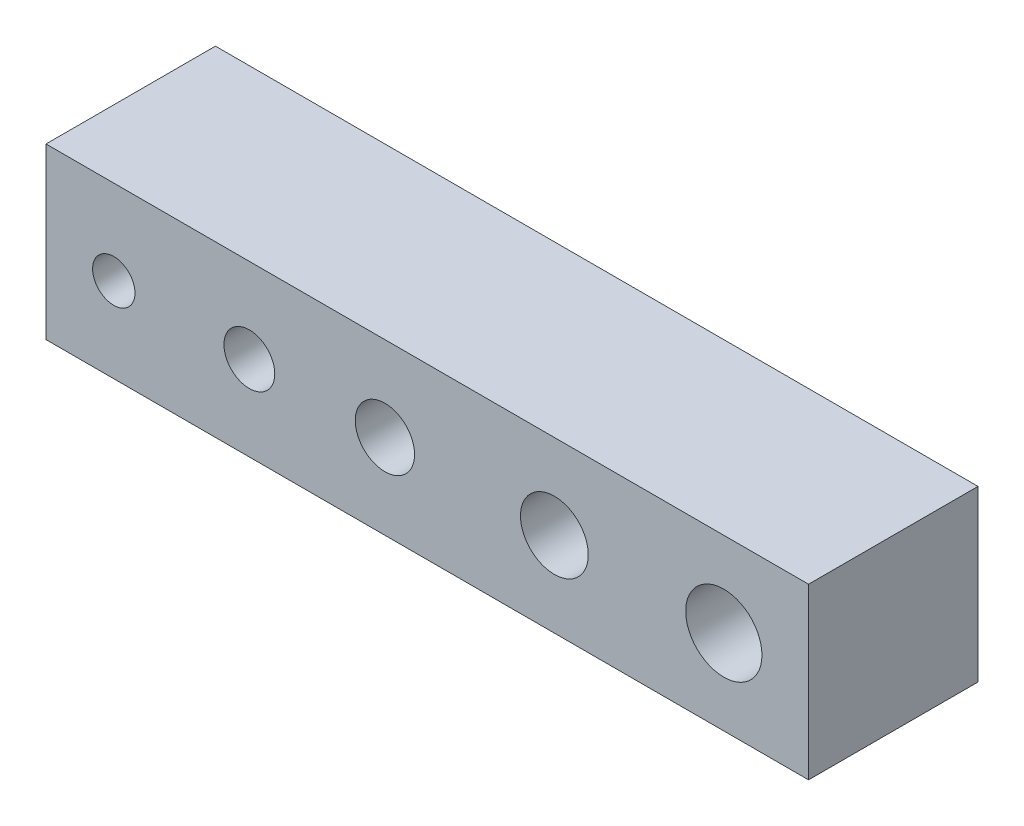
ISO-10303-21;
HEADER;
FILE_DESCRIPTION(('STEP AP214'),'2;1');
FILE_NAME('part.step','',(''),(''),'','','');
FILE_SCHEMA(('AUTOMOTIVE_DESIGN { 1 0 10303 214 1 1 1 1 }'));
ENDSEC;
DATA;
#1=APPLICATION_CONTEXT('core data for automotive mechanical design processes');
#2=APPLICATION_PROTOCOL_DEFINITION('international standard','automotive_design',2000,#1);
#3=PRODUCT_CONTEXT('',#1,'mechanical');
#4=PRODUCT('Part','Part','',(#3));
#5=PRODUCT_RELATED_PRODUCT_CATEGORY('part','',(#4));
#6=PRODUCT_DEFINITION_FORMATION('','',#4);
#7=PRODUCT_DEFINITION_CONTEXT('part definition',#1,'design');
#8=PRODUCT_DEFINITION('design','',#6,#7);
#9=PRODUCT_DEFINITION_SHAPE('','',#8);
#10=(LENGTH_UNIT() NAMED_UNIT(*) SI_UNIT(.MILLI.,.METRE.));
#11=(NAMED_UNIT(*) PLANE_ANGLE_UNIT() SI_UNIT($,.RADIAN.));
#12=(NAMED_UNIT(*) SI_UNIT($,.STERADIAN.) SOLID_ANGLE_UNIT());
#13=UNCERTAINTY_MEASURE_WITH_UNIT(LENGTH_MEASURE(1.E-05),#10,'distance_accuracy_value','');
#14=(GEOMETRIC_REPRESENTATION_CONTEXT(3) GLOBAL_UNCERTAINTY_ASSIGNED_CONTEXT((#13)) GLOBAL_UNIT_ASSIGNED_CONTEXT((#10,
#11,#12)) REPRESENTATION_CONTEXT('',''));
#15=CARTESIAN_POINT('',(0.,0.,0.));
#16=DIRECTION('',(0.,0.,1.));
#17=DIRECTION('',(1.,0.,0.));
#18=AXIS2_PLACEMENT_3D('',#15,#16,#17);
#19=CARTESIAN_POINT('',(0.,0.,10.));
#20=DIRECTION('',(-1.,0.,0.));
#21=DIRECTION('',(0.,-1.,0.));
#22=AXIS2_PLACEMENT_3D('',#19,#20,#21);
#23=PLANE('',#22);
#24=DIRECTION('',(0.,1.,0.));
#25=VECTOR('',#24,1.);
#26=CARTESIAN_POINT('',(0.,0.,0.));
#27=LINE('',#26,#25);
#28=CARTESIAN_POINT('',(0.,-10.,0.));
#29=VERTEX_POINT('',#28);
#30=CARTESIAN_POINT('',(0.,0.,0.));
#31=VERTEX_POINT('',#30);
#32=EDGE_CURVE('E110',#29,#31,#27,.T.);
#33=ORIENTED_EDGE('',*,*,#32,.T.);
#34=DIRECTION('',(0.,0.,-1.));
#35=VECTOR('',#34,1.);
#36=CARTESIAN_POINT('',(0.,0.,10.));
#37=LINE('',#36,#35);
#38=CARTESIAN_POINT('',(0.,0.,10.));
#39=VERTEX_POINT('',#38);
#40=EDGE_CURVE('E11',#39,#31,#37,.T.);
#41=ORIENTED_EDGE('',*,*,#40,.F.);
#42=DIRECTION('',(0.,1.,0.));
#43=VECTOR('',#42,1.);
#44=CARTESIAN_POINT('',(0.,0.,10.));
#45=LINE('',#44,#43);
#46=CARTESIAN_POINT('',(0.,-10.,10.));
#47=VERTEX_POINT('',#46);
#48=EDGE_CURVE('E93',#47,#39,#45,.T.);
#49=ORIENTED_EDGE('',*,*,#48,.F.);
#50=DIRECTION('',(0.,0.,-1.));
#51=VECTOR('',#50,1.);
#52=CARTESIAN_POINT('',(0.,-10.,10.));
#53=LINE('',#52,#51);
#54=EDGE_CURVE('E106',#47,#29,#53,.T.);
#55=ORIENTED_EDGE('',*,*,#54,.T.);
#56=EDGE_LOOP('',(#33,#41,#49,#55));
#57=FACE_BOUND('',#56,.T.);
#58=ADVANCED_FACE('F39',(#57),#23,.F.);
#59=CARTESIAN_POINT('',(0.,0.,10.));
#60=DIRECTION('',(0.,-1.,0.));
#61=DIRECTION('',(1.,0.,0.));
#62=AXIS2_PLACEMENT_3D('',#59,#60,#61);
#63=PLANE('',#62);
#64=DIRECTION('',(-1.,0.,0.));
#65=VECTOR('',#64,1.);
#66=CARTESIAN_POINT('',(0.,0.,0.));
#67=LINE('',#66,#65);
#68=CARTESIAN_POINT('',(-45.,0.,0.));
#69=VERTEX_POINT('',#68);
#70=EDGE_CURVE('E98',#31,#69,#67,.T.);
#71=ORIENTED_EDGE('',*,*,#70,.T.);
#72=DIRECTION('',(0.,0.,-1.));
#73=VECTOR('',#72,1.);
#74=CARTESIAN_POINT('',(-45.,0.,10.));
#75=LINE('',#74,#73);
#76=CARTESIAN_POINT('',(-45.,0.,10.));
#77=VERTEX_POINT('',#76);
#78=EDGE_CURVE('E49',#77,#69,#75,.T.);
#79=ORIENTED_EDGE('',*,*,#78,.F.);
#80=DIRECTION('',(-1.,0.,0.));
#81=VECTOR('',#80,1.);
#82=CARTESIAN_POINT('',(0.,0.,10.));
#83=LINE('',#82,#81);
#84=EDGE_CURVE('E88',#39,#77,#83,.T.);
#85=ORIENTED_EDGE('',*,*,#84,.F.);
#86=ORIENTED_EDGE('',*,*,#40,.T.);
#87=EDGE_LOOP('',(#71,#79,#85,#86));
#88=FACE_BOUND('',#87,.T.);
#89=ADVANCED_FACE('F97',(#88),#63,.F.);
#90=CARTESIAN_POINT('',(-45.,0.,10.));
#91=DIRECTION('',(1.,0.,0.));
#92=DIRECTION('',(0.,0.,-1.));
#93=AXIS2_PLACEMENT_3D('',#90,#91,#92);
#94=PLANE('',#93);
#95=DIRECTION('',(0.,-1.,0.));
#96=VECTOR('',#95,1.);
#97=CARTESIAN_POINT('',(-45.,0.,0.));
#98=LINE('',#97,#96);
#99=CARTESIAN_POINT('',(-45.,-10.,0.));
#100=VERTEX_POINT('',#99);
#101=EDGE_CURVE('E75',#69,#100,#98,.T.);
#102=ORIENTED_EDGE('',*,*,#101,.T.);
#103=DIRECTION('',(0.,0.,-1.));
#104=VECTOR('',#103,1.);
#105=CARTESIAN_POINT('',(-45.,-10.,10.));
#106=LINE('',#105,#104);
#107=CARTESIAN_POINT('',(-45.,-10.,10.));
#108=VERTEX_POINT('',#107);
#109=EDGE_CURVE('E100',#108,#100,#106,.T.);
#110=ORIENTED_EDGE('',*,*,#109,.F.);
#111=DIRECTION('',(0.,-1.,0.));
#112=VECTOR('',#111,1.);
#113=CARTESIAN_POINT('',(-45.,0.,10.));
#114=LINE('',#113,#112);
#115=EDGE_CURVE('E91',#77,#108,#114,.T.);
#116=ORIENTED_EDGE('',*,*,#115,.F.);
#117=ORIENTED_EDGE('',*,*,#78,.T.);
#118=EDGE_LOOP('',(#102,#110,#116,#117));
#119=FACE_BOUND('',#118,.T.);
#120=ADVANCED_FACE('F102',(#119),#94,.F.);
#121=CARTESIAN_POINT('',(0.,-10.,10.));
#122=DIRECTION('',(0.,1.,0.));
#123=DIRECTION('',(-1.,0.,0.));
#124=AXIS2_PLACEMENT_3D('',#121,#122,#123);
#125=PLANE('',#124);
#126=DIRECTION('',(1.,0.,0.));
#127=VECTOR('',#126,1.);
#128=CARTESIAN_POINT('',(0.,-10.,0.));
#129=LINE('',#128,#127);
#130=EDGE_CURVE('E81',#100,#29,#129,.T.);
#131=ORIENTED_EDGE('',*,*,#130,.T.);
#132=ORIENTED_EDGE('',*,*,#54,.F.);
#133=DIRECTION('',(1.,0.,0.));
#134=VECTOR('',#133,1.);
#135=CARTESIAN_POINT('',(0.,-10.,10.));
#136=LINE('',#135,#134);
#137=EDGE_CURVE('E58',#108,#47,#136,.T.);
#138=ORIENTED_EDGE('',*,*,#137,.F.);
#139=ORIENTED_EDGE('',*,*,#109,.T.);
#140=EDGE_LOOP('',(#131,#132,#138,#139));
#141=FACE_BOUND('',#140,.T.);
#142=ADVANCED_FACE('F162',(#141),#125,.F.);
#143=CARTESIAN_POINT('',(0.,0.,10.));
#144=DIRECTION('',(0.,0.,-1.));
#145=DIRECTION('',(-1.,0.,0.));
#146=AXIS2_PLACEMENT_3D('',#143,#144,#145);
#147=PLANE('',#146);
#148=CARTESIAN_POINT('',(-41.,-5.00000000000001,10.));
#149=DIRECTION('',(0.,0.,1.));
#150=DIRECTION('',(1.,0.,0.));
#151=AXIS2_PLACEMENT_3D('',#148,#149,#150);
#152=CIRCLE('',#151,1.25);
#153=CARTESIAN_POINT('',(-39.75,-5.00000000000001,10.));
#154=VERTEX_POINT('',#153);
#155=EDGE_CURVE('E129',#154,#154,#152,.T.);
#156=ORIENTED_EDGE('',*,*,#155,.F.);
#157=EDGE_LOOP('',(#156));
#158=FACE_BOUND('',#157,.T.);
#159=CARTESIAN_POINT('',(-33.,-5.00000000000001,10.));
#160=DIRECTION('',(0.,0.,1.));
#161=DIRECTION('',(1.,0.,0.));
#162=AXIS2_PLACEMENT_3D('',#159,#160,#161);
#163=CIRCLE('',#162,1.5);
#164=CARTESIAN_POINT('',(-31.5,-5.00000000000001,10.));
#165=VERTEX_POINT('',#164);
#166=EDGE_CURVE('E251',#165,#165,#163,.T.);
#167=ORIENTED_EDGE('',*,*,#166,.F.);
#168=EDGE_LOOP('',(#167));
#169=FACE_BOUND('',#168,.T.);
#170=CARTESIAN_POINT('',(-25.,-5.00000000000001,10.));
#171=DIRECTION('',(0.,0.,1.));
#172=DIRECTION('',(1.,0.,0.));
#173=AXIS2_PLACEMENT_3D('',#170,#171,#172);
#174=CIRCLE('',#173,1.75);
#175=CARTESIAN_POINT('',(-23.25,-5.00000000000001,10.));
#176=VERTEX_POINT('',#175);
#177=EDGE_CURVE('E254',#176,#176,#174,.T.);
#178=ORIENTED_EDGE('',*,*,#177,.F.);
#179=EDGE_LOOP('',(#178));
#180=FACE_BOUND('',#179,.T.);
#181=CARTESIAN_POINT('',(-15.,-5.00000000000001,10.));
#182=DIRECTION('',(0.,0.,1.));
#183=DIRECTION('',(1.,0.,0.));
#184=AXIS2_PLACEMENT_3D('',#181,#182,#183);
#185=CIRCLE('',#184,2.);
#186=CARTESIAN_POINT('',(-13.,-5.00000000000001,10.));
#187=VERTEX_POINT('',#186);
#188=EDGE_CURVE('E261',#187,#187,#185,.T.);
#189=ORIENTED_EDGE('',*,*,#188,.F.);
#190=EDGE_LOOP('',(#189));
#191=FACE_BOUND('',#190,.T.);
#192=CARTESIAN_POINT('',(-4.99999999999999,-5.00000000000001,10.));
#193=DIRECTION('',(0.,0.,1.));
#194=DIRECTION('',(1.,0.,0.));
#195=AXIS2_PLACEMENT_3D('',#192,#193,#194);
#196=CIRCLE('',#195,2.25);
#197=CARTESIAN_POINT('',(-2.74999999999999,-5.00000000000001,10.));
#198=VERTEX_POINT('',#197);
#199=EDGE_CURVE('E267',#198,#198,#196,.T.);
#200=ORIENTED_EDGE('',*,*,#199,.F.);
#201=EDGE_LOOP('',(#200));
#202=FACE_BOUND('',#201,.T.);
#203=ORIENTED_EDGE('',*,*,#48,.T.);
#204=ORIENTED_EDGE('',*,*,#84,.T.);
#205=ORIENTED_EDGE('',*,*,#115,.T.);
#206=ORIENTED_EDGE('',*,*,#137,.T.);
#207=EDGE_LOOP('',(#203,#204,#205,#206));
#208=FACE_BOUND('',#207,.T.);
#209=ADVANCED_FACE('F89',(#158,#169,#180,#191,#202,#208),#147,.F.);
#210=CARTESIAN_POINT('',(0.,0.,0.));
#211=DIRECTION('',(0.,0.,-1.));
#212=DIRECTION('',(-1.,0.,0.));
#213=AXIS2_PLACEMENT_3D('',#210,#211,#212);
#214=PLANE('',#213);
#215=CARTESIAN_POINT('',(-41.,-5.00000000000001,0.));
#216=DIRECTION('',(0.,0.,-1.));
#217=DIRECTION('',(-1.,0.,0.));
#218=AXIS2_PLACEMENT_3D('',#215,#216,#217);
#219=CIRCLE('',#218,1.25);
#220=CARTESIAN_POINT('',(-42.25,-5.00000000000001,0.));
#221=VERTEX_POINT('',#220);
#222=EDGE_CURVE('E42',#221,#221,#219,.T.);
#223=ORIENTED_EDGE('',*,*,#222,.F.);
#224=EDGE_LOOP('',(#223));
#225=FACE_BOUND('',#224,.T.);
#226=CARTESIAN_POINT('',(-33.,-5.00000000000001,0.));
#227=DIRECTION('',(0.,0.,-1.));
#228=DIRECTION('',(-1.,0.,0.));
#229=AXIS2_PLACEMENT_3D('',#226,#227,#228);
#230=CIRCLE('',#229,1.5);
#231=CARTESIAN_POINT('',(-34.5,-5.00000000000001,0.));
#232=VERTEX_POINT('',#231);
#233=EDGE_CURVE('E136',#232,#232,#230,.T.);
#234=ORIENTED_EDGE('',*,*,#233,.F.);
#235=EDGE_LOOP('',(#234));
#236=FACE_BOUND('',#235,.T.);
#237=CARTESIAN_POINT('',(-25.,-5.00000000000001,0.));
#238=DIRECTION('',(0.,0.,-1.));
#239=DIRECTION('',(-1.,0.,0.));
#240=AXIS2_PLACEMENT_3D('',#237,#238,#239);
#241=CIRCLE('',#240,1.75);
#242=CARTESIAN_POINT('',(-26.75,-5.00000000000001,0.));
#243=VERTEX_POINT('',#242);
#244=EDGE_CURVE('E133',#243,#243,#241,.T.);
#245=ORIENTED_EDGE('',*,*,#244,.F.);
#246=EDGE_LOOP('',(#245));
#247=FACE_BOUND('',#246,.T.);
#248=CARTESIAN_POINT('',(-15.,-5.00000000000001,0.));
#249=DIRECTION('',(0.,0.,-1.));
#250=DIRECTION('',(-1.,0.,0.));
#251=AXIS2_PLACEMENT_3D('',#248,#249,#250);
#252=CIRCLE('',#251,2.);
#253=CARTESIAN_POINT('',(-17.,-5.00000000000001,0.));
#254=VERTEX_POINT('',#253);
#255=EDGE_CURVE('E128',#254,#254,#252,.T.);
#256=ORIENTED_EDGE('',*,*,#255,.F.);
#257=EDGE_LOOP('',(#256));
#258=FACE_BOUND('',#257,.T.);
#259=CARTESIAN_POINT('',(-4.99999999999999,-5.00000000000001,0.));
#260=DIRECTION('',(0.,0.,-1.));
#261=DIRECTION('',(-1.,0.,0.));
#262=AXIS2_PLACEMENT_3D('',#259,#260,#261);
#263=CIRCLE('',#262,2.25);
#264=CARTESIAN_POINT('',(-7.24999999999999,-5.00000000000001,0.));
#265=VERTEX_POINT('',#264);
#266=EDGE_CURVE('E124',#265,#265,#263,.T.);
#267=ORIENTED_EDGE('',*,*,#266,.F.);
#268=EDGE_LOOP('',(#267));
#269=FACE_BOUND('',#268,.T.);
#270=ORIENTED_EDGE('',*,*,#32,.F.);
#271=ORIENTED_EDGE('',*,*,#130,.F.);
#272=ORIENTED_EDGE('',*,*,#101,.F.);
#273=ORIENTED_EDGE('',*,*,#70,.F.);
#274=EDGE_LOOP('',(#270,#271,#272,#273));
#275=FACE_BOUND('',#274,.T.);
#276=ADVANCED_FACE('F148',(#225,#236,#247,#258,#269,#275),#214,.T.);
#277=CARTESIAN_POINT('',(-4.99999999999999,-5.00000000000001,-6.));
#278=DIRECTION('',(0.,0.,1.));
#279=DIRECTION('',(1.,0.,0.));
#280=AXIS2_PLACEMENT_3D('',#277,#278,#279);
#281=CYLINDRICAL_SURFACE('',#280,2.25);
#282=ORIENTED_EDGE('',*,*,#266,.T.);
#283=EDGE_LOOP('',(#282));
#284=FACE_BOUND('',#283,.T.);
#285=ORIENTED_EDGE('',*,*,#199,.T.);
#286=EDGE_LOOP('',(#285));
#287=FACE_BOUND('',#286,.T.);
#288=ADVANCED_FACE('F151',(#284,#287),#281,.F.);
#289=CARTESIAN_POINT('',(-15.,-5.00000000000001,-6.));
#290=DIRECTION('',(0.,0.,1.));
#291=DIRECTION('',(1.,0.,0.));
#292=AXIS2_PLACEMENT_3D('',#289,#290,#291);
#293=CYLINDRICAL_SURFACE('',#292,2.);
#294=ORIENTED_EDGE('',*,*,#255,.T.);
#295=EDGE_LOOP('',(#294));
#296=FACE_BOUND('',#295,.T.);
#297=ORIENTED_EDGE('',*,*,#188,.T.);
#298=EDGE_LOOP('',(#297));
#299=FACE_BOUND('',#298,.T.);
#300=ADVANCED_FACE('F207',(#296,#299),#293,.F.);
#301=CARTESIAN_POINT('',(-25.,-5.00000000000001,-6.));
#302=DIRECTION('',(0.,0.,1.));
#303=DIRECTION('',(1.,0.,0.));
#304=AXIS2_PLACEMENT_3D('',#301,#302,#303);
#305=CYLINDRICAL_SURFACE('',#304,1.75);
#306=ORIENTED_EDGE('',*,*,#244,.T.);
#307=EDGE_LOOP('',(#306));
#308=FACE_BOUND('',#307,.T.);
#309=ORIENTED_EDGE('',*,*,#177,.T.);
#310=EDGE_LOOP('',(#309));
#311=FACE_BOUND('',#310,.T.);
#312=ADVANCED_FACE('F217',(#308,#311),#305,.F.);
#313=CARTESIAN_POINT('',(-33.,-5.00000000000001,-6.));
#314=DIRECTION('',(0.,0.,1.));
#315=DIRECTION('',(1.,0.,0.));
#316=AXIS2_PLACEMENT_3D('',#313,#314,#315);
#317=CYLINDRICAL_SURFACE('',#316,1.5);
#318=ORIENTED_EDGE('',*,*,#233,.T.);
#319=EDGE_LOOP('',(#318));
#320=FACE_BOUND('',#319,.T.);
#321=ORIENTED_EDGE('',*,*,#166,.T.);
#322=EDGE_LOOP('',(#321));
#323=FACE_BOUND('',#322,.T.);
#324=ADVANCED_FACE('F227',(#320,#323),#317,.F.);
#325=CARTESIAN_POINT('',(-41.,-5.00000000000001,-6.));
#326=DIRECTION('',(0.,0.,1.));
#327=DIRECTION('',(1.,0.,0.));
#328=AXIS2_PLACEMENT_3D('',#325,#326,#327);
#329=CYLINDRICAL_SURFACE('',#328,1.25);
#330=ORIENTED_EDGE('',*,*,#222,.T.);
#331=EDGE_LOOP('',(#330));
#332=FACE_BOUND('',#331,.T.);
#333=ORIENTED_EDGE('',*,*,#155,.T.);
#334=EDGE_LOOP('',(#333));
#335=FACE_BOUND('',#334,.T.);
#336=ADVANCED_FACE('F145',(#332,#335),#329,.F.);
#337=CLOSED_SHELL('',(#58,#89,#120,#142,#209,#276,#288,#300,#312,#324,#336));
#338=MANIFOLD_SOLID_BREP('B2',#337);
#339=ADVANCED_BREP_SHAPE_REPRESENTATION('',(#18,#338),#14);
#340=SHAPE_DEFINITION_REPRESENTATION(#9,#339);
ENDSEC;
END-ISO-10303-21;
